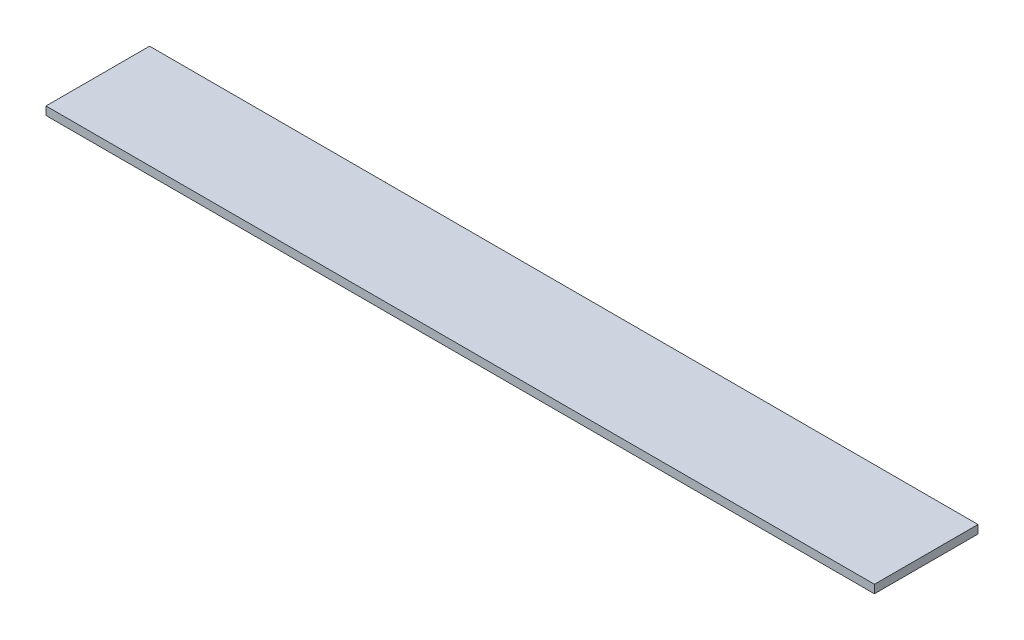
ISO-10303-21;
HEADER;
FILE_DESCRIPTION(('STEP AP214'),'2;1');
FILE_NAME('part.step','',(''),(''),'','','');
FILE_SCHEMA(('AUTOMOTIVE_DESIGN { 1 0 10303 214 1 1 1 1 }'));
ENDSEC;
DATA;
#1=APPLICATION_CONTEXT('core data for automotive mechanical design processes');
#2=APPLICATION_PROTOCOL_DEFINITION('international standard','automotive_design',2000,#1);
#3=PRODUCT_CONTEXT('',#1,'mechanical');
#4=PRODUCT('Part','Part','',(#3));
#5=PRODUCT_RELATED_PRODUCT_CATEGORY('part','',(#4));
#6=PRODUCT_DEFINITION_FORMATION('','',#4);
#7=PRODUCT_DEFINITION_CONTEXT('part definition',#1,'design');
#8=PRODUCT_DEFINITION('design','',#6,#7);
#9=PRODUCT_DEFINITION_SHAPE('','',#8);
#10=(LENGTH_UNIT() NAMED_UNIT(*) SI_UNIT(.MILLI.,.METRE.));
#11=(NAMED_UNIT(*) PLANE_ANGLE_UNIT() SI_UNIT($,.RADIAN.));
#12=(NAMED_UNIT(*) SI_UNIT($,.STERADIAN.) SOLID_ANGLE_UNIT());
#13=UNCERTAINTY_MEASURE_WITH_UNIT(LENGTH_MEASURE(1.E-05),#10,'distance_accuracy_value','');
#14=(GEOMETRIC_REPRESENTATION_CONTEXT(3) GLOBAL_UNCERTAINTY_ASSIGNED_CONTEXT((#13)) GLOBAL_UNIT_ASSIGNED_CONTEXT((#10,
#11,#12)) REPRESENTATION_CONTEXT('',''));
#15=CARTESIAN_POINT('',(0.,0.,0.));
#16=DIRECTION('',(0.,0.,1.));
#17=DIRECTION('',(1.,0.,0.));
#18=AXIS2_PLACEMENT_3D('',#15,#16,#17);
#19=CARTESIAN_POINT('',(100.,2.,-12.5));
#20=DIRECTION('',(-1.,0.,0.));
#21=DIRECTION('',(0.,0.,1.));
#22=AXIS2_PLACEMENT_3D('',#19,#20,#21);
#23=PLANE('',#22);
#24=DIRECTION('',(0.,0.,-1.));
#25=VECTOR('',#24,1.);
#26=CARTESIAN_POINT('',(100.,0.,-12.5));
#27=LINE('',#26,#25);
#28=CARTESIAN_POINT('',(100.,0.,12.5));
#29=VERTEX_POINT('',#28);
#30=CARTESIAN_POINT('',(100.,0.,-12.5));
#31=VERTEX_POINT('',#30);
#32=EDGE_CURVE('E102',#29,#31,#27,.T.);
#33=ORIENTED_EDGE('',*,*,#32,.T.);
#34=DIRECTION('',(0.,-1.,0.));
#35=VECTOR('',#34,1.);
#36=CARTESIAN_POINT('',(100.,2.,-12.5));
#37=LINE('',#36,#35);
#38=CARTESIAN_POINT('',(100.,2.,-12.5));
#39=VERTEX_POINT('',#38);
#40=EDGE_CURVE('E11',#39,#31,#37,.T.);
#41=ORIENTED_EDGE('',*,*,#40,.F.);
#42=DIRECTION('',(0.,0.,-1.));
#43=VECTOR('',#42,1.);
#44=CARTESIAN_POINT('',(100.,2.,-12.5));
#45=LINE('',#44,#43);
#46=CARTESIAN_POINT('',(100.,2.,12.5));
#47=VERTEX_POINT('',#46);
#48=EDGE_CURVE('E90',#47,#39,#45,.T.);
#49=ORIENTED_EDGE('',*,*,#48,.F.);
#50=DIRECTION('',(0.,-1.,0.));
#51=VECTOR('',#50,1.);
#52=CARTESIAN_POINT('',(100.,2.,12.5));
#53=LINE('',#52,#51);
#54=EDGE_CURVE('E98',#47,#29,#53,.T.);
#55=ORIENTED_EDGE('',*,*,#54,.T.);
#56=EDGE_LOOP('',(#33,#41,#49,#55));
#57=FACE_BOUND('',#56,.T.);
#58=ADVANCED_FACE('F39',(#57),#23,.F.);
#59=CARTESIAN_POINT('',(-100.,2.,-12.5));
#60=DIRECTION('',(0.,0.,1.));
#61=DIRECTION('',(1.,0.,0.));
#62=AXIS2_PLACEMENT_3D('',#59,#60,#61);
#63=PLANE('',#62);
#64=DIRECTION('',(-1.,0.,0.));
#65=VECTOR('',#64,1.);
#66=CARTESIAN_POINT('',(-100.,0.,-12.5));
#67=LINE('',#66,#65);
#68=CARTESIAN_POINT('',(-100.,0.,-12.5));
#69=VERTEX_POINT('',#68);
#70=EDGE_CURVE('E94',#31,#69,#67,.T.);
#71=ORIENTED_EDGE('',*,*,#70,.T.);
#72=DIRECTION('',(0.,-1.,0.));
#73=VECTOR('',#72,1.);
#74=CARTESIAN_POINT('',(-100.,2.,-12.5));
#75=LINE('',#74,#73);
#76=CARTESIAN_POINT('',(-100.,2.,-12.5));
#77=VERTEX_POINT('',#76);
#78=EDGE_CURVE('E47',#77,#69,#75,.T.);
#79=ORIENTED_EDGE('',*,*,#78,.F.);
#80=DIRECTION('',(-1.,0.,0.));
#81=VECTOR('',#80,1.);
#82=CARTESIAN_POINT('',(-100.,2.,-12.5));
#83=LINE('',#82,#81);
#84=EDGE_CURVE('E85',#39,#77,#83,.T.);
#85=ORIENTED_EDGE('',*,*,#84,.F.);
#86=ORIENTED_EDGE('',*,*,#40,.T.);
#87=EDGE_LOOP('',(#71,#79,#85,#86));
#88=FACE_BOUND('',#87,.T.);
#89=ADVANCED_FACE('F93',(#88),#63,.F.);
#90=CARTESIAN_POINT('',(-100.,2.,-12.5));
#91=DIRECTION('',(1.,0.,0.));
#92=DIRECTION('',(0.,0.,-1.));
#93=AXIS2_PLACEMENT_3D('',#90,#91,#92);
#94=PLANE('',#93);
#95=DIRECTION('',(0.,0.,1.));
#96=VECTOR('',#95,1.);
#97=CARTESIAN_POINT('',(-100.,0.,-12.5));
#98=LINE('',#97,#96);
#99=CARTESIAN_POINT('',(-100.,0.,12.5));
#100=VERTEX_POINT('',#99);
#101=EDGE_CURVE('E72',#69,#100,#98,.T.);
#102=ORIENTED_EDGE('',*,*,#101,.T.);
#103=DIRECTION('',(0.,-1.,0.));
#104=VECTOR('',#103,1.);
#105=CARTESIAN_POINT('',(-100.,2.,12.5));
#106=LINE('',#105,#104);
#107=CARTESIAN_POINT('',(-100.,2.,12.5));
#108=VERTEX_POINT('',#107);
#109=EDGE_CURVE('E95',#108,#100,#106,.T.);
#110=ORIENTED_EDGE('',*,*,#109,.F.);
#111=DIRECTION('',(0.,0.,1.));
#112=VECTOR('',#111,1.);
#113=CARTESIAN_POINT('',(-100.,2.,-12.5));
#114=LINE('',#113,#112);
#115=EDGE_CURVE('E88',#77,#108,#114,.T.);
#116=ORIENTED_EDGE('',*,*,#115,.F.);
#117=ORIENTED_EDGE('',*,*,#78,.T.);
#118=EDGE_LOOP('',(#102,#110,#116,#117));
#119=FACE_BOUND('',#118,.T.);
#120=ADVANCED_FACE('F96',(#119),#94,.F.);
#121=CARTESIAN_POINT('',(-100.,2.,12.5));
#122=DIRECTION('',(0.,0.,-1.));
#123=DIRECTION('',(-1.,0.,0.));
#124=AXIS2_PLACEMENT_3D('',#121,#122,#123);
#125=PLANE('',#124);
#126=DIRECTION('',(1.,0.,0.));
#127=VECTOR('',#126,1.);
#128=CARTESIAN_POINT('',(-100.,0.,12.5));
#129=LINE('',#128,#127);
#130=EDGE_CURVE('E78',#100,#29,#129,.T.);
#131=ORIENTED_EDGE('',*,*,#130,.T.);
#132=ORIENTED_EDGE('',*,*,#54,.F.);
#133=DIRECTION('',(1.,0.,0.));
#134=VECTOR('',#133,1.);
#135=CARTESIAN_POINT('',(-100.,2.,12.5));
#136=LINE('',#135,#134);
#137=EDGE_CURVE('E55',#108,#47,#136,.T.);
#138=ORIENTED_EDGE('',*,*,#137,.F.);
#139=ORIENTED_EDGE('',*,*,#109,.T.);
#140=EDGE_LOOP('',(#131,#132,#138,#139));
#141=FACE_BOUND('',#140,.T.);
#142=ADVANCED_FACE('F109',(#141),#125,.F.);
#143=CARTESIAN_POINT('',(0.,2.,0.));
#144=DIRECTION('',(0.,1.,0.));
#145=DIRECTION('',(0.,0.,1.));
#146=AXIS2_PLACEMENT_3D('',#143,#144,#145);
#147=PLANE('',#146);
#148=ORIENTED_EDGE('',*,*,#48,.T.);
#149=ORIENTED_EDGE('',*,*,#84,.T.);
#150=ORIENTED_EDGE('',*,*,#115,.T.);
#151=ORIENTED_EDGE('',*,*,#137,.T.);
#152=EDGE_LOOP('',(#148,#149,#150,#151));
#153=FACE_BOUND('',#152,.T.);
#154=ADVANCED_FACE('F86',(#153),#147,.T.);
#155=CARTESIAN_POINT('',(0.,0.,0.));
#156=DIRECTION('',(0.,1.,0.));
#157=DIRECTION('',(0.,0.,1.));
#158=AXIS2_PLACEMENT_3D('',#155,#156,#157);
#159=PLANE('',#158);
#160=ORIENTED_EDGE('',*,*,#32,.F.);
#161=ORIENTED_EDGE('',*,*,#130,.F.);
#162=ORIENTED_EDGE('',*,*,#101,.F.);
#163=ORIENTED_EDGE('',*,*,#70,.F.);
#164=EDGE_LOOP('',(#160,#161,#162,#163));
#165=FACE_BOUND('',#164,.T.);
#166=ADVANCED_FACE('F112',(#165),#159,.F.);
#167=CLOSED_SHELL('',(#58,#89,#120,#142,#154,#166));
#168=MANIFOLD_SOLID_BREP('B2',#167);
#169=ADVANCED_BREP_SHAPE_REPRESENTATION('',(#18,#168),#14);
#170=SHAPE_DEFINITION_REPRESENTATION(#9,#169);
ENDSEC;
END-ISO-10303-21;
